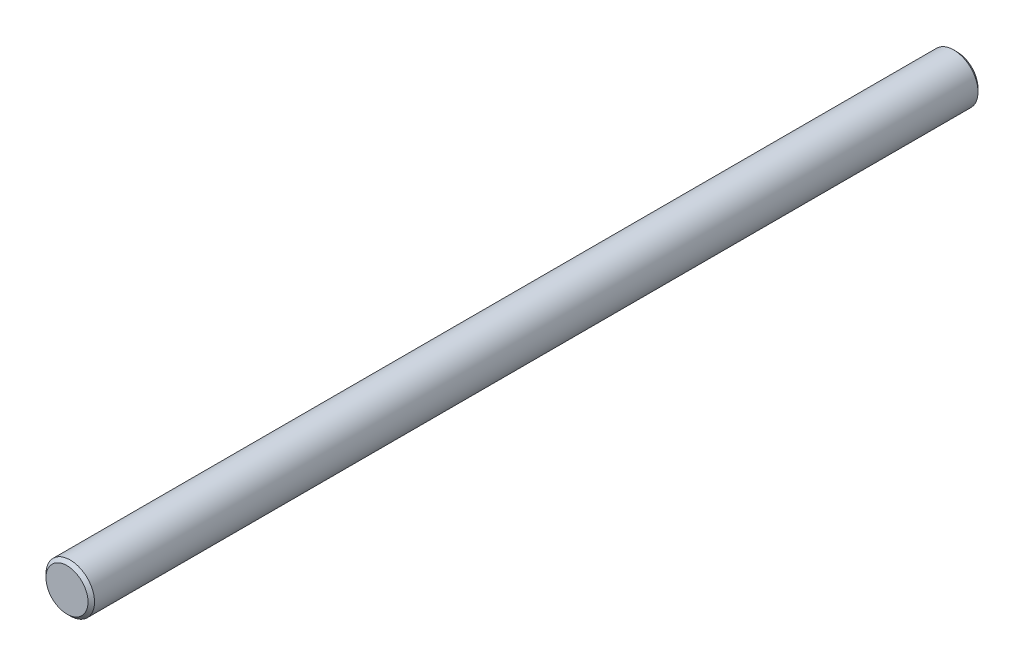
ISO-10303-21;
HEADER;
FILE_DESCRIPTION(('STEP AP214'),'2;1');
FILE_NAME('part.step','',(''),(''),'','','');
FILE_SCHEMA(('AUTOMOTIVE_DESIGN { 1 0 10303 214 1 1 1 1 }'));
ENDSEC;
DATA;
#1=APPLICATION_CONTEXT('core data for automotive mechanical design processes');
#2=APPLICATION_PROTOCOL_DEFINITION('international standard','automotive_design',2000,#1);
#3=PRODUCT_CONTEXT('',#1,'mechanical');
#4=PRODUCT('Part','Part','',(#3));
#5=PRODUCT_RELATED_PRODUCT_CATEGORY('part','',(#4));
#6=PRODUCT_DEFINITION_FORMATION('','',#4);
#7=PRODUCT_DEFINITION_CONTEXT('part definition',#1,'design');
#8=PRODUCT_DEFINITION('design','',#6,#7);
#9=PRODUCT_DEFINITION_SHAPE('','',#8);
#10=(LENGTH_UNIT() NAMED_UNIT(*) SI_UNIT(.MILLI.,.METRE.));
#11=(NAMED_UNIT(*) PLANE_ANGLE_UNIT() SI_UNIT($,.RADIAN.));
#12=(NAMED_UNIT(*) SI_UNIT($,.STERADIAN.) SOLID_ANGLE_UNIT());
#13=UNCERTAINTY_MEASURE_WITH_UNIT(LENGTH_MEASURE(1.E-05),#10,'distance_accuracy_value','');
#14=(GEOMETRIC_REPRESENTATION_CONTEXT(3) GLOBAL_UNCERTAINTY_ASSIGNED_CONTEXT((#13)) GLOBAL_UNIT_ASSIGNED_CONTEXT((#10,
#11,#12)) REPRESENTATION_CONTEXT('',''));
#15=CARTESIAN_POINT('',(0.,0.,0.));
#16=DIRECTION('',(0.,0.,1.));
#17=DIRECTION('',(1.,0.,0.));
#18=AXIS2_PLACEMENT_3D('',#15,#16,#17);
#19=CARTESIAN_POINT('',(0.,0.,55.));
#20=DIRECTION('',(0.,0.,-1.));
#21=DIRECTION('',(-1.,0.,0.));
#22=AXIS2_PLACEMENT_3D('',#19,#20,#21);
#23=CYLINDRICAL_SURFACE('',#22,1.5);
#24=CARTESIAN_POINT('',(0.,0.,54.8));
#25=DIRECTION('',(0.,0.,1.));
#26=DIRECTION('',(1.,0.,0.));
#27=AXIS2_PLACEMENT_3D('',#24,#25,#26);
#28=CIRCLE('',#27,1.5);
#29=CARTESIAN_POINT('',(1.5,0.,54.8));
#30=VERTEX_POINT('',#29);
#31=EDGE_CURVE('E47',#30,#30,#28,.F.);
#32=ORIENTED_EDGE('',*,*,#31,.T.);
#33=EDGE_LOOP('',(#32));
#34=FACE_BOUND('',#33,.T.);
#35=CARTESIAN_POINT('',(0.,0.,0.199999999999999));
#36=DIRECTION('',(0.,0.,1.));
#37=DIRECTION('',(1.,0.,0.));
#38=AXIS2_PLACEMENT_3D('',#35,#36,#37);
#39=CIRCLE('',#38,1.5);
#40=CARTESIAN_POINT('',(1.5,0.,0.199999999999999));
#41=VERTEX_POINT('',#40);
#42=EDGE_CURVE('E51',#41,#41,#39,.T.);
#43=ORIENTED_EDGE('',*,*,#42,.T.);
#44=EDGE_LOOP('',(#43));
#45=FACE_BOUND('',#44,.T.);
#46=ADVANCED_FACE('F39',(#34,#45),#23,.T.);
#47=CARTESIAN_POINT('',(0.,0.,55.));
#48=DIRECTION('',(0.,0.,1.));
#49=DIRECTION('',(1.,0.,0.));
#50=AXIS2_PLACEMENT_3D('',#47,#48,#49);
#51=PLANE('',#50);
#52=CARTESIAN_POINT('',(0.,0.,55.));
#53=DIRECTION('',(0.,0.,1.));
#54=DIRECTION('',(1.,0.,0.));
#55=AXIS2_PLACEMENT_3D('',#52,#53,#54);
#56=CIRCLE('',#55,1.3);
#57=CARTESIAN_POINT('',(1.3,0.,55.));
#58=VERTEX_POINT('',#57);
#59=EDGE_CURVE('E55',#58,#58,#56,.T.);
#60=ORIENTED_EDGE('',*,*,#59,.T.);
#61=EDGE_LOOP('',(#60));
#62=FACE_BOUND('',#61,.T.);
#63=ADVANCED_FACE('F61',(#62),#51,.T.);
#64=CARTESIAN_POINT('',(0.,0.,0.));
#65=DIRECTION('',(0.,0.,1.));
#66=DIRECTION('',(1.,0.,0.));
#67=AXIS2_PLACEMENT_3D('',#64,#65,#66);
#68=PLANE('',#67);
#69=CARTESIAN_POINT('',(0.,0.,0.));
#70=DIRECTION('',(0.,0.,1.));
#71=DIRECTION('',(1.,0.,0.));
#72=AXIS2_PLACEMENT_3D('',#69,#70,#71);
#73=CIRCLE('',#72,1.3);
#74=CARTESIAN_POINT('',(1.3,0.,0.));
#75=VERTEX_POINT('',#74);
#76=EDGE_CURVE('E10',#75,#75,#73,.F.);
#77=ORIENTED_EDGE('',*,*,#76,.T.);
#78=EDGE_LOOP('',(#77));
#79=FACE_BOUND('',#78,.T.);
#80=ADVANCED_FACE('F65',(#79),#68,.F.);
#81=CARTESIAN_POINT('',(0.,0.,55.));
#82=DIRECTION('',(0.,0.,-1.));
#83=DIRECTION('',(-1.,0.,0.));
#84=AXIS2_PLACEMENT_3D('',#81,#82,#83);
#85=CONICAL_SURFACE('',#84,1.3,0.785398163397462);
#86=ORIENTED_EDGE('',*,*,#31,.F.);
#87=EDGE_LOOP('',(#86));
#88=FACE_BOUND('',#87,.T.);
#89=ORIENTED_EDGE('',*,*,#59,.F.);
#90=EDGE_LOOP('',(#89));
#91=FACE_BOUND('',#90,.T.);
#92=ADVANCED_FACE('F63',(#88,#91),#85,.T.);
#93=CARTESIAN_POINT('',(0.,0.,0.199999999999999));
#94=DIRECTION('',(0.,0.,1.));
#95=DIRECTION('',(1.,0.,0.));
#96=AXIS2_PLACEMENT_3D('',#93,#94,#95);
#97=CONICAL_SURFACE('',#96,1.5,0.785398163397445);
#98=ORIENTED_EDGE('',*,*,#76,.F.);
#99=EDGE_LOOP('',(#98));
#100=FACE_BOUND('',#99,.T.);
#101=ORIENTED_EDGE('',*,*,#42,.F.);
#102=EDGE_LOOP('',(#101));
#103=FACE_BOUND('',#102,.T.);
#104=ADVANCED_FACE('F42',(#100,#103),#97,.T.);
#105=CLOSED_SHELL('',(#46,#63,#80,#92,#104));
#106=MANIFOLD_SOLID_BREP('B2',#105);
#107=ADVANCED_BREP_SHAPE_REPRESENTATION('',(#18,#106),#14);
#108=SHAPE_DEFINITION_REPRESENTATION(#9,#107);
ENDSEC;
END-ISO-10303-21;
